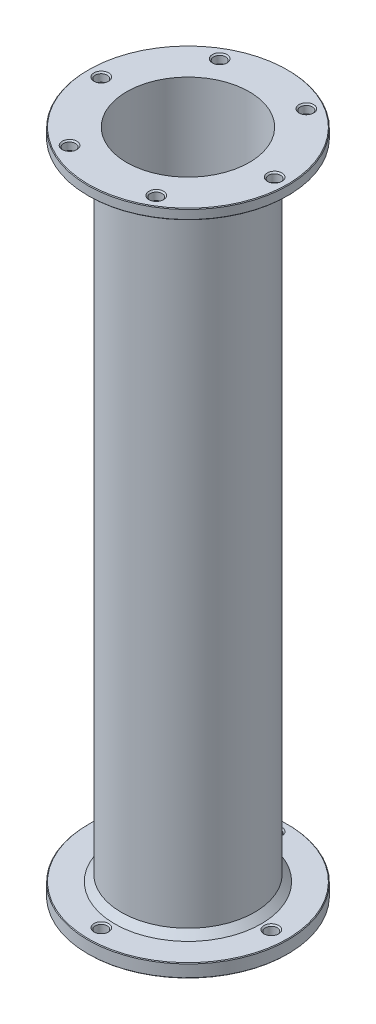
ISO-10303-21;
HEADER;
FILE_DESCRIPTION(('STEP AP214'),'2;1');
FILE_NAME('part.step','',(''),(''),'','','');
FILE_SCHEMA(('AUTOMOTIVE_DESIGN { 1 0 10303 214 1 1 1 1 }'));
ENDSEC;
DATA;
#1=APPLICATION_CONTEXT('core data for automotive mechanical design processes');
#2=APPLICATION_PROTOCOL_DEFINITION('international standard','automotive_design',2000,#1);
#3=PRODUCT_CONTEXT('',#1,'mechanical');
#4=PRODUCT('Part','Part','',(#3));
#5=PRODUCT_RELATED_PRODUCT_CATEGORY('part','',(#4));
#6=PRODUCT_DEFINITION_FORMATION('','',#4);
#7=PRODUCT_DEFINITION_CONTEXT('part definition',#1,'design');
#8=PRODUCT_DEFINITION('design','',#6,#7);
#9=PRODUCT_DEFINITION_SHAPE('','',#8);
#10=(LENGTH_UNIT() NAMED_UNIT(*) SI_UNIT(.MILLI.,.METRE.));
#11=(NAMED_UNIT(*) PLANE_ANGLE_UNIT() SI_UNIT($,.RADIAN.));
#12=(NAMED_UNIT(*) SI_UNIT($,.STERADIAN.) SOLID_ANGLE_UNIT());
#13=UNCERTAINTY_MEASURE_WITH_UNIT(LENGTH_MEASURE(1.E-05),#10,'distance_accuracy_value','');
#14=(GEOMETRIC_REPRESENTATION_CONTEXT(3) GLOBAL_UNCERTAINTY_ASSIGNED_CONTEXT((#13)) GLOBAL_UNIT_ASSIGNED_CONTEXT((#10,
#11,#12)) REPRESENTATION_CONTEXT('',''));
#15=CARTESIAN_POINT('',(0.,0.,0.));
#16=DIRECTION('',(0.,0.,1.));
#17=DIRECTION('',(1.,0.,0.));
#18=AXIS2_PLACEMENT_3D('',#15,#16,#17);
#19=CARTESIAN_POINT('',(0.,20.,0.));
#20=DIRECTION('',(0.,1.,0.));
#21=DIRECTION('',(0.,0.,1.));
#22=AXIS2_PLACEMENT_3D('',#19,#20,#21);
#23=PLANE('',#22);
#24=CARTESIAN_POINT('',(-5.00000000000045,20.,125.));
#25=DIRECTION('',(0.,1.,0.));
#26=DIRECTION('',(0.,0.,1.));
#27=AXIS2_PLACEMENT_3D('',#24,#25,#26);
#28=CIRCLE('',#27,11.0000000000001);
#29=CARTESIAN_POINT('',(-5.00000000000045,20.,136.000000000001));
#30=VERTEX_POINT('',#29);
#31=EDGE_CURVE('E142',#30,#30,#28,.F.);
#32=ORIENTED_EDGE('',*,*,#31,.T.);
#33=EDGE_LOOP('',(#32));
#34=FACE_BOUND('',#33,.T.);
#35=CARTESIAN_POINT('',(-130.,20.,-5.00000000000007));
#36=DIRECTION('',(0.,1.,0.));
#37=DIRECTION('',(0.,0.,1.));
#38=AXIS2_PLACEMENT_3D('',#35,#36,#37);
#39=CIRCLE('',#38,11.0000000000001);
#40=CARTESIAN_POINT('',(-130.,20.,6.00000000000005));
#41=VERTEX_POINT('',#40);
#42=EDGE_CURVE('E145',#41,#41,#39,.F.);
#43=ORIENTED_EDGE('',*,*,#42,.T.);
#44=EDGE_LOOP('',(#43));
#45=FACE_BOUND('',#44,.T.);
#46=CARTESIAN_POINT('',(0.,20.,-130.));
#47=DIRECTION('',(0.,1.,0.));
#48=DIRECTION('',(0.,0.,1.));
#49=AXIS2_PLACEMENT_3D('',#46,#47,#48);
#50=CIRCLE('',#49,11.0000000000001);
#51=CARTESIAN_POINT('',(0.,20.,-119.));
#52=VERTEX_POINT('',#51);
#53=EDGE_CURVE('E148',#52,#52,#50,.F.);
#54=ORIENTED_EDGE('',*,*,#53,.T.);
#55=EDGE_LOOP('',(#54));
#56=FACE_BOUND('',#55,.T.);
#57=CARTESIAN_POINT('',(125.,20.,4.36435167355392E-13));
#58=DIRECTION('',(0.,1.,0.));
#59=DIRECTION('',(0.,0.,1.));
#60=AXIS2_PLACEMENT_3D('',#57,#58,#59);
#61=CIRCLE('',#60,11.0000000000001);
#62=CARTESIAN_POINT('',(125.,20.,11.0000000000006));
#63=VERTEX_POINT('',#62);
#64=EDGE_CURVE('E151',#63,#63,#61,.F.);
#65=ORIENTED_EDGE('',*,*,#64,.T.);
#66=EDGE_LOOP('',(#65));
#67=FACE_BOUND('',#66,.T.);
#68=CARTESIAN_POINT('',(0.,20.,0.));
#69=DIRECTION('',(0.,1.,0.));
#70=DIRECTION('',(0.,0.,1.));
#71=AXIS2_PLACEMENT_3D('',#68,#69,#70);
#72=CIRCLE('',#71,149.);
#73=CARTESIAN_POINT('',(0.,20.,149.));
#74=VERTEX_POINT('',#73);
#75=EDGE_CURVE('E184',#74,#74,#72,.T.);
#76=ORIENTED_EDGE('',*,*,#75,.T.);
#77=EDGE_LOOP('',(#76));
#78=FACE_BOUND('',#77,.T.);
#79=CARTESIAN_POINT('',(0.,20.,0.));
#80=DIRECTION('',(0.,1.,0.));
#81=DIRECTION('',(0.,0.,1.));
#82=AXIS2_PLACEMENT_3D('',#79,#80,#81);
#83=CIRCLE('',#82,110.);
#84=CARTESIAN_POINT('',(0.,20.,110.));
#85=VERTEX_POINT('',#84);
#86=EDGE_CURVE('E196',#85,#85,#83,.F.);
#87=ORIENTED_EDGE('',*,*,#86,.T.);
#88=EDGE_LOOP('',(#87));
#89=FACE_BOUND('',#88,.T.);
#90=ADVANCED_FACE('F43',(#34,#45,#56,#67,#78,#89),#23,.T.);
#91=CARTESIAN_POINT('',(0.,0.,0.));
#92=DIRECTION('',(0.,1.,0.));
#93=DIRECTION('',(0.,0.,1.));
#94=AXIS2_PLACEMENT_3D('',#91,#92,#93);
#95=PLANE('',#94);
#96=CARTESIAN_POINT('',(-5.00000000000045,0.,125.));
#97=DIRECTION('',(0.,1.,0.));
#98=DIRECTION('',(0.,0.,1.));
#99=AXIS2_PLACEMENT_3D('',#96,#97,#98);
#100=CIRCLE('',#99,11.0000000000001);
#101=CARTESIAN_POINT('',(-5.00000000000045,0.,136.000000000001));
#102=VERTEX_POINT('',#101);
#103=EDGE_CURVE('E160',#102,#102,#100,.T.);
#104=ORIENTED_EDGE('',*,*,#103,.T.);
#105=EDGE_LOOP('',(#104));
#106=FACE_BOUND('',#105,.T.);
#107=CARTESIAN_POINT('',(-130.,0.,-5.00000000000007));
#108=DIRECTION('',(0.,1.,0.));
#109=DIRECTION('',(0.,0.,1.));
#110=AXIS2_PLACEMENT_3D('',#107,#108,#109);
#111=CIRCLE('',#110,10.9999999999999);
#112=CARTESIAN_POINT('',(-130.,0.,5.99999999999983));
#113=VERTEX_POINT('',#112);
#114=EDGE_CURVE('E163',#113,#113,#111,.T.);
#115=ORIENTED_EDGE('',*,*,#114,.T.);
#116=EDGE_LOOP('',(#115));
#117=FACE_BOUND('',#116,.T.);
#118=CARTESIAN_POINT('',(0.,0.,-130.));
#119=DIRECTION('',(0.,1.,0.));
#120=DIRECTION('',(0.,0.,1.));
#121=AXIS2_PLACEMENT_3D('',#118,#119,#120);
#122=CIRCLE('',#121,11.);
#123=CARTESIAN_POINT('',(0.,0.,-119.));
#124=VERTEX_POINT('',#123);
#125=EDGE_CURVE('E166',#124,#124,#122,.T.);
#126=ORIENTED_EDGE('',*,*,#125,.T.);
#127=EDGE_LOOP('',(#126));
#128=FACE_BOUND('',#127,.T.);
#129=CARTESIAN_POINT('',(125.,0.,4.36435167355392E-13));
#130=DIRECTION('',(0.,1.,0.));
#131=DIRECTION('',(0.,0.,1.));
#132=AXIS2_PLACEMENT_3D('',#129,#130,#131);
#133=CIRCLE('',#132,10.9999999999999);
#134=CARTESIAN_POINT('',(125.,0.,11.0000000000003));
#135=VERTEX_POINT('',#134);
#136=EDGE_CURVE('E169',#135,#135,#133,.T.);
#137=ORIENTED_EDGE('',*,*,#136,.T.);
#138=EDGE_LOOP('',(#137));
#139=FACE_BOUND('',#138,.T.);
#140=CARTESIAN_POINT('',(0.,0.,0.));
#141=DIRECTION('',(0.,1.,0.));
#142=DIRECTION('',(0.,0.,1.));
#143=AXIS2_PLACEMENT_3D('',#140,#141,#142);
#144=CIRCLE('',#143,149.);
#145=CARTESIAN_POINT('',(0.,0.,149.));
#146=VERTEX_POINT('',#145);
#147=EDGE_CURVE('E187',#146,#146,#144,.F.);
#148=ORIENTED_EDGE('',*,*,#147,.T.);
#149=EDGE_LOOP('',(#148));
#150=FACE_BOUND('',#149,.T.);
#151=CARTESIAN_POINT('',(0.,0.,0.));
#152=DIRECTION('',(0.,1.,0.));
#153=DIRECTION('',(0.,0.,1.));
#154=AXIS2_PLACEMENT_3D('',#151,#152,#153);
#155=CIRCLE('',#154,92.);
#156=CARTESIAN_POINT('',(0.,0.,92.));
#157=VERTEX_POINT('',#156);
#158=EDGE_CURVE('E208',#157,#157,#155,.T.);
#159=ORIENTED_EDGE('',*,*,#158,.T.);
#160=EDGE_LOOP('',(#159));
#161=FACE_BOUND('',#160,.T.);
#162=ADVANCED_FACE('F237',(#106,#117,#128,#139,#150,#161),#95,.F.);
#163=CARTESIAN_POINT('',(0.,20.,0.));
#164=DIRECTION('',(0.,-1.,0.));
#165=DIRECTION('',(0.,0.,-1.));
#166=AXIS2_PLACEMENT_3D('',#163,#164,#165);
#167=CYLINDRICAL_SURFACE('',#166,150.);
#168=CARTESIAN_POINT('',(0.,0.99999999999989,0.));
#169=DIRECTION('',(0.,1.,0.));
#170=DIRECTION('',(0.,0.,1.));
#171=AXIS2_PLACEMENT_3D('',#168,#169,#170);
#172=CIRCLE('',#171,150.);
#173=CARTESIAN_POINT('',(0.,0.99999999999989,150.));
#174=VERTEX_POINT('',#173);
#175=EDGE_CURVE('E190',#174,#174,#172,.T.);
#176=ORIENTED_EDGE('',*,*,#175,.T.);
#177=EDGE_LOOP('',(#176));
#178=FACE_BOUND('',#177,.T.);
#179=CARTESIAN_POINT('',(0.,18.9999999999998,0.));
#180=DIRECTION('',(0.,1.,0.));
#181=DIRECTION('',(0.,0.,1.));
#182=AXIS2_PLACEMENT_3D('',#179,#180,#181);
#183=CIRCLE('',#182,150.);
#184=CARTESIAN_POINT('',(0.,18.9999999999998,150.));
#185=VERTEX_POINT('',#184);
#186=EDGE_CURVE('E193',#185,#185,#183,.F.);
#187=ORIENTED_EDGE('',*,*,#186,.T.);
#188=EDGE_LOOP('',(#187));
#189=FACE_BOUND('',#188,.T.);
#190=ADVANCED_FACE('F244',(#178,#189),#167,.T.);
#191=CARTESIAN_POINT('',(0.,20.,0.));
#192=DIRECTION('',(0.,-1.,0.));
#193=DIRECTION('',(0.,0.,-1.));
#194=AXIS2_PLACEMENT_3D('',#191,#192,#193);
#195=CYLINDRICAL_SURFACE('',#194,92.);
#196=ORIENTED_EDGE('',*,*,#158,.F.);
#197=EDGE_LOOP('',(#196));
#198=FACE_BOUND('',#197,.T.);
#199=CARTESIAN_POINT('',(0.,1000.,0.));
#200=DIRECTION('',(0.,1.,0.));
#201=DIRECTION('',(0.,0.,1.));
#202=AXIS2_PLACEMENT_3D('',#199,#200,#201);
#203=CIRCLE('',#202,92.);
#204=CARTESIAN_POINT('',(0.,1000.,92.0000000000001));
#205=VERTEX_POINT('',#204);
#206=EDGE_CURVE('E211',#205,#205,#203,.T.);
#207=ORIENTED_EDGE('',*,*,#206,.T.);
#208=EDGE_LOOP('',(#207));
#209=FACE_BOUND('',#208,.T.);
#210=ADVANCED_FACE('F215',(#198,#209),#195,.F.);
#211=CARTESIAN_POINT('',(0.,20.,-130.));
#212=DIRECTION('',(0.,-1.,0.));
#213=DIRECTION('',(0.,0.,-1.));
#214=AXIS2_PLACEMENT_3D('',#211,#212,#213);
#215=CYLINDRICAL_SURFACE('',#214,9.00000000000001);
#216=CARTESIAN_POINT('',(0.,1.99999999999992,-130.));
#217=DIRECTION('',(0.,1.,0.));
#218=DIRECTION('',(0.,0.,1.));
#219=AXIS2_PLACEMENT_3D('',#216,#217,#218);
#220=CIRCLE('',#219,9.00000000000001);
#221=CARTESIAN_POINT('',(0.,1.99999999999992,-121.));
#222=VERTEX_POINT('',#221);
#223=EDGE_CURVE('E130',#222,#222,#220,.F.);
#224=ORIENTED_EDGE('',*,*,#223,.T.);
#225=EDGE_LOOP('',(#224));
#226=FACE_BOUND('',#225,.T.);
#227=CARTESIAN_POINT('',(0.,18.,-130.));
#228=DIRECTION('',(0.,1.,0.));
#229=DIRECTION('',(0.,0.,1.));
#230=AXIS2_PLACEMENT_3D('',#227,#228,#229);
#231=CIRCLE('',#230,9.00000000000001);
#232=CARTESIAN_POINT('',(0.,18.,-121.));
#233=VERTEX_POINT('',#232);
#234=EDGE_CURVE('E133',#233,#233,#231,.T.);
#235=ORIENTED_EDGE('',*,*,#234,.T.);
#236=EDGE_LOOP('',(#235));
#237=FACE_BOUND('',#236,.T.);
#238=ADVANCED_FACE('F464',(#226,#237),#215,.F.);
#239=CARTESIAN_POINT('',(125.,20.,4.36435167355392E-13));
#240=DIRECTION('',(0.,-1.,0.));
#241=DIRECTION('',(0.,0.,-1.));
#242=AXIS2_PLACEMENT_3D('',#239,#240,#241);
#243=CYLINDRICAL_SURFACE('',#242,9.00000000000001);
#244=CARTESIAN_POINT('',(125.,1.99999999999997,4.36435167355392E-13));
#245=DIRECTION('',(0.,1.,0.));
#246=DIRECTION('',(0.,0.,1.));
#247=AXIS2_PLACEMENT_3D('',#244,#245,#246);
#248=CIRCLE('',#247,9.00000000000001);
#249=CARTESIAN_POINT('',(125.,1.99999999999997,9.00000000000045));
#250=VERTEX_POINT('',#249);
#251=EDGE_CURVE('E124',#250,#250,#248,.F.);
#252=ORIENTED_EDGE('',*,*,#251,.T.);
#253=EDGE_LOOP('',(#252));
#254=FACE_BOUND('',#253,.T.);
#255=CARTESIAN_POINT('',(125.,18.,4.36435167355392E-13));
#256=DIRECTION('',(0.,1.,0.));
#257=DIRECTION('',(0.,0.,1.));
#258=AXIS2_PLACEMENT_3D('',#255,#256,#257);
#259=CIRCLE('',#258,9.00000000000001);
#260=CARTESIAN_POINT('',(125.,18.,9.00000000000045));
#261=VERTEX_POINT('',#260);
#262=EDGE_CURVE('E127',#261,#261,#259,.T.);
#263=ORIENTED_EDGE('',*,*,#262,.T.);
#264=EDGE_LOOP('',(#263));
#265=FACE_BOUND('',#264,.T.);
#266=ADVANCED_FACE('F461',(#254,#265),#243,.F.);
#267=CARTESIAN_POINT('',(-5.00000000000045,20.,125.));
#268=DIRECTION('',(0.,-1.,0.));
#269=DIRECTION('',(0.,0.,-1.));
#270=AXIS2_PLACEMENT_3D('',#267,#268,#269);
#271=CYLINDRICAL_SURFACE('',#270,8.99999999999999);
#272=CARTESIAN_POINT('',(-5.00000000000045,2.00000000000003,125.));
#273=DIRECTION('',(0.,1.,0.));
#274=DIRECTION('',(0.,0.,1.));
#275=AXIS2_PLACEMENT_3D('',#272,#273,#274);
#276=CIRCLE('',#275,8.99999999999999);
#277=CARTESIAN_POINT('',(-5.00000000000045,2.00000000000003,134.));
#278=VERTEX_POINT('',#277);
#279=EDGE_CURVE('E154',#278,#278,#276,.F.);
#280=ORIENTED_EDGE('',*,*,#279,.T.);
#281=EDGE_LOOP('',(#280));
#282=FACE_BOUND('',#281,.T.);
#283=CARTESIAN_POINT('',(-5.00000000000045,18.,125.));
#284=DIRECTION('',(0.,1.,0.));
#285=DIRECTION('',(0.,0.,1.));
#286=AXIS2_PLACEMENT_3D('',#283,#284,#285);
#287=CIRCLE('',#286,8.99999999999999);
#288=CARTESIAN_POINT('',(-5.00000000000045,18.,134.));
#289=VERTEX_POINT('',#288);
#290=EDGE_CURVE('E157',#289,#289,#287,.T.);
#291=ORIENTED_EDGE('',*,*,#290,.T.);
#292=EDGE_LOOP('',(#291));
#293=FACE_BOUND('',#292,.T.);
#294=ADVANCED_FACE('F457',(#282,#293),#271,.F.);
#295=CARTESIAN_POINT('',(-130.,20.,-5.00000000000007));
#296=DIRECTION('',(0.,-1.,0.));
#297=DIRECTION('',(0.,0.,-1.));
#298=AXIS2_PLACEMENT_3D('',#295,#296,#297);
#299=CYLINDRICAL_SURFACE('',#298,9.00000000000001);
#300=CARTESIAN_POINT('',(-130.,1.99999999999997,-5.00000000000007));
#301=DIRECTION('',(0.,1.,0.));
#302=DIRECTION('',(0.,0.,1.));
#303=AXIS2_PLACEMENT_3D('',#300,#301,#302);
#304=CIRCLE('',#303,9.00000000000001);
#305=CARTESIAN_POINT('',(-130.,1.99999999999997,3.99999999999994));
#306=VERTEX_POINT('',#305);
#307=EDGE_CURVE('E136',#306,#306,#304,.F.);
#308=ORIENTED_EDGE('',*,*,#307,.T.);
#309=EDGE_LOOP('',(#308));
#310=FACE_BOUND('',#309,.T.);
#311=CARTESIAN_POINT('',(-130.,18.,-5.00000000000007));
#312=DIRECTION('',(0.,1.,0.));
#313=DIRECTION('',(0.,0.,1.));
#314=AXIS2_PLACEMENT_3D('',#311,#312,#313);
#315=CIRCLE('',#314,9.00000000000001);
#316=CARTESIAN_POINT('',(-130.,18.,3.99999999999994));
#317=VERTEX_POINT('',#316);
#318=EDGE_CURVE('E139',#317,#317,#315,.T.);
#319=ORIENTED_EDGE('',*,*,#318,.T.);
#320=EDGE_LOOP('',(#319));
#321=FACE_BOUND('',#320,.T.);
#322=ADVANCED_FACE('F231',(#310,#321),#299,.F.);
#323=CARTESIAN_POINT('',(0.,985.,0.));
#324=DIRECTION('',(0.,-1.,0.));
#325=DIRECTION('',(0.,0.,-1.));
#326=AXIS2_PLACEMENT_3D('',#323,#324,#325);
#327=CYLINDRICAL_SURFACE('',#326,100.);
#328=CARTESIAN_POINT('',(0.,975.,0.));
#329=DIRECTION('',(0.,1.,0.));
#330=DIRECTION('',(0.,0.,1.));
#331=AXIS2_PLACEMENT_3D('',#328,#329,#330);
#332=CIRCLE('',#331,100.);
#333=CARTESIAN_POINT('',(0.,975.,100.));
#334=VERTEX_POINT('',#333);
#335=EDGE_CURVE('E199',#334,#334,#332,.F.);
#336=ORIENTED_EDGE('',*,*,#335,.T.);
#337=EDGE_LOOP('',(#336));
#338=FACE_BOUND('',#337,.T.);
#339=CARTESIAN_POINT('',(0.,29.9999999999999,0.));
#340=DIRECTION('',(0.,1.,0.));
#341=DIRECTION('',(0.,0.,1.));
#342=AXIS2_PLACEMENT_3D('',#339,#340,#341);
#343=CIRCLE('',#342,100.);
#344=CARTESIAN_POINT('',(0.,29.9999999999999,100.));
#345=VERTEX_POINT('',#344);
#346=EDGE_CURVE('E202',#345,#345,#343,.T.);
#347=ORIENTED_EDGE('',*,*,#346,.T.);
#348=EDGE_LOOP('',(#347));
#349=FACE_BOUND('',#348,.T.);
#350=ADVANCED_FACE('F220',(#338,#349),#327,.T.);
#351=CARTESIAN_POINT('',(0.,1000.,0.));
#352=DIRECTION('',(0.,1.,0.));
#353=DIRECTION('',(0.,0.,1.));
#354=AXIS2_PLACEMENT_3D('',#351,#352,#353);
#355=PLANE('',#354);
#356=CARTESIAN_POINT('',(-65.0000000000001,1000.,-112.583302491977));
#357=DIRECTION('',(0.,1.,0.));
#358=DIRECTION('',(0.,0.,1.));
#359=AXIS2_PLACEMENT_3D('',#356,#357,#358);
#360=CIRCLE('',#359,11.0000000000002);
#361=CARTESIAN_POINT('',(-65.0000000000001,1000.,-101.583302491977));
#362=VERTEX_POINT('',#361);
#363=EDGE_CURVE('E82',#362,#362,#360,.F.);
#364=ORIENTED_EDGE('',*,*,#363,.T.);
#365=EDGE_LOOP('',(#364));
#366=FACE_BOUND('',#365,.T.);
#367=CARTESIAN_POINT('',(-130.,1000.,0.));
#368=DIRECTION('',(0.,1.,0.));
#369=DIRECTION('',(0.,0.,1.));
#370=AXIS2_PLACEMENT_3D('',#367,#368,#369);
#371=CIRCLE('',#370,11.0000000000002);
#372=CARTESIAN_POINT('',(-130.,1000.,11.0000000000003));
#373=VERTEX_POINT('',#372);
#374=EDGE_CURVE('E85',#373,#373,#371,.F.);
#375=ORIENTED_EDGE('',*,*,#374,.T.);
#376=EDGE_LOOP('',(#375));
#377=FACE_BOUND('',#376,.T.);
#378=CARTESIAN_POINT('',(-65.,1000.,112.583302491977));
#379=DIRECTION('',(0.,1.,0.));
#380=DIRECTION('',(0.,0.,1.));
#381=AXIS2_PLACEMENT_3D('',#378,#379,#380);
#382=CIRCLE('',#381,11.0000000000002);
#383=CARTESIAN_POINT('',(-65.,1000.,123.583302491977));
#384=VERTEX_POINT('',#383);
#385=EDGE_CURVE('E88',#384,#384,#382,.F.);
#386=ORIENTED_EDGE('',*,*,#385,.T.);
#387=EDGE_LOOP('',(#386));
#388=FACE_BOUND('',#387,.T.);
#389=CARTESIAN_POINT('',(65.,1000.,112.583302491977));
#390=DIRECTION('',(0.,1.,0.));
#391=DIRECTION('',(0.,0.,1.));
#392=AXIS2_PLACEMENT_3D('',#389,#390,#391);
#393=CIRCLE('',#392,11.0000000000002);
#394=CARTESIAN_POINT('',(65.,1000.,123.583302491977));
#395=VERTEX_POINT('',#394);
#396=EDGE_CURVE('E91',#395,#395,#393,.F.);
#397=ORIENTED_EDGE('',*,*,#396,.T.);
#398=EDGE_LOOP('',(#397));
#399=FACE_BOUND('',#398,.T.);
#400=CARTESIAN_POINT('',(130.,1000.,0.));
#401=DIRECTION('',(0.,1.,0.));
#402=DIRECTION('',(0.,0.,1.));
#403=AXIS2_PLACEMENT_3D('',#400,#401,#402);
#404=CIRCLE('',#403,11.0000000000002);
#405=CARTESIAN_POINT('',(130.,1000.,11.0000000000003));
#406=VERTEX_POINT('',#405);
#407=EDGE_CURVE('E94',#406,#406,#404,.F.);
#408=ORIENTED_EDGE('',*,*,#407,.T.);
#409=EDGE_LOOP('',(#408));
#410=FACE_BOUND('',#409,.T.);
#411=CARTESIAN_POINT('',(65.,1000.,-112.583302491977));
#412=DIRECTION('',(0.,1.,0.));
#413=DIRECTION('',(0.,0.,1.));
#414=AXIS2_PLACEMENT_3D('',#411,#412,#413);
#415=CIRCLE('',#414,11.0000000000002);
#416=CARTESIAN_POINT('',(65.,1000.,-101.583302491977));
#417=VERTEX_POINT('',#416);
#418=EDGE_CURVE('E97',#417,#417,#415,.F.);
#419=ORIENTED_EDGE('',*,*,#418,.T.);
#420=EDGE_LOOP('',(#419));
#421=FACE_BOUND('',#420,.T.);
#422=CARTESIAN_POINT('',(0.,1000.,0.));
#423=DIRECTION('',(0.,1.,0.));
#424=DIRECTION('',(0.,0.,1.));
#425=AXIS2_PLACEMENT_3D('',#422,#423,#424);
#426=CIRCLE('',#425,149.);
#427=CARTESIAN_POINT('',(0.,1000.,149.));
#428=VERTEX_POINT('',#427);
#429=EDGE_CURVE('E172',#428,#428,#426,.T.);
#430=ORIENTED_EDGE('',*,*,#429,.T.);
#431=EDGE_LOOP('',(#430));
#432=FACE_BOUND('',#431,.T.);
#433=ORIENTED_EDGE('',*,*,#206,.F.);
#434=EDGE_LOOP('',(#433));
#435=FACE_BOUND('',#434,.T.);
#436=ADVANCED_FACE('F217',(#366,#377,#388,#399,#410,#421,#432,#435),#355,.T.);
#437=CARTESIAN_POINT('',(0.,985.,0.));
#438=DIRECTION('',(0.,1.,0.));
#439=DIRECTION('',(0.,0.,1.));
#440=AXIS2_PLACEMENT_3D('',#437,#438,#439);
#441=PLANE('',#440);
#442=CARTESIAN_POINT('',(-65.0000000000001,985.,-112.583302491977));
#443=DIRECTION('',(0.,1.,0.));
#444=DIRECTION('',(0.,0.,1.));
#445=AXIS2_PLACEMENT_3D('',#442,#443,#444);
#446=CIRCLE('',#445,11.0000000000003);
#447=CARTESIAN_POINT('',(-65.0000000000001,985.,-101.583302491977));
#448=VERTEX_POINT('',#447);
#449=EDGE_CURVE('E106',#448,#448,#446,.T.);
#450=ORIENTED_EDGE('',*,*,#449,.T.);
#451=EDGE_LOOP('',(#450));
#452=FACE_BOUND('',#451,.T.);
#453=CARTESIAN_POINT('',(-130.,985.,0.));
#454=DIRECTION('',(0.,1.,0.));
#455=DIRECTION('',(0.,0.,1.));
#456=AXIS2_PLACEMENT_3D('',#453,#454,#455);
#457=CIRCLE('',#456,11.0000000000002);
#458=CARTESIAN_POINT('',(-130.,985.,11.0000000000003));
#459=VERTEX_POINT('',#458);
#460=EDGE_CURVE('E109',#459,#459,#457,.T.);
#461=ORIENTED_EDGE('',*,*,#460,.T.);
#462=EDGE_LOOP('',(#461));
#463=FACE_BOUND('',#462,.T.);
#464=CARTESIAN_POINT('',(-65.,985.,112.583302491977));
#465=DIRECTION('',(0.,1.,0.));
#466=DIRECTION('',(0.,0.,1.));
#467=AXIS2_PLACEMENT_3D('',#464,#465,#466);
#468=CIRCLE('',#467,11.0000000000003);
#469=CARTESIAN_POINT('',(-65.,985.,123.583302491977));
#470=VERTEX_POINT('',#469);
#471=EDGE_CURVE('E112',#470,#470,#468,.T.);
#472=ORIENTED_EDGE('',*,*,#471,.T.);
#473=EDGE_LOOP('',(#472));
#474=FACE_BOUND('',#473,.T.);
#475=CARTESIAN_POINT('',(65.,985.,112.583302491977));
#476=DIRECTION('',(0.,1.,0.));
#477=DIRECTION('',(0.,0.,1.));
#478=AXIS2_PLACEMENT_3D('',#475,#476,#477);
#479=CIRCLE('',#478,11.0000000000003);
#480=CARTESIAN_POINT('',(65.,985.,123.583302491977));
#481=VERTEX_POINT('',#480);
#482=EDGE_CURVE('E115',#481,#481,#479,.T.);
#483=ORIENTED_EDGE('',*,*,#482,.T.);
#484=EDGE_LOOP('',(#483));
#485=FACE_BOUND('',#484,.T.);
#486=CARTESIAN_POINT('',(130.,985.,0.));
#487=DIRECTION('',(0.,1.,0.));
#488=DIRECTION('',(0.,0.,1.));
#489=AXIS2_PLACEMENT_3D('',#486,#487,#488);
#490=CIRCLE('',#489,11.0000000000002);
#491=CARTESIAN_POINT('',(130.,985.,11.0000000000003));
#492=VERTEX_POINT('',#491);
#493=EDGE_CURVE('E118',#492,#492,#490,.T.);
#494=ORIENTED_EDGE('',*,*,#493,.T.);
#495=EDGE_LOOP('',(#494));
#496=FACE_BOUND('',#495,.T.);
#497=CARTESIAN_POINT('',(65.,985.,-112.583302491977));
#498=DIRECTION('',(0.,1.,0.));
#499=DIRECTION('',(0.,0.,1.));
#500=AXIS2_PLACEMENT_3D('',#497,#498,#499);
#501=CIRCLE('',#500,11.0000000000003);
#502=CARTESIAN_POINT('',(65.,985.,-101.583302491977));
#503=VERTEX_POINT('',#502);
#504=EDGE_CURVE('E121',#503,#503,#501,.T.);
#505=ORIENTED_EDGE('',*,*,#504,.T.);
#506=EDGE_LOOP('',(#505));
#507=FACE_BOUND('',#506,.T.);
#508=CARTESIAN_POINT('',(0.,985.,0.));
#509=DIRECTION('',(0.,1.,0.));
#510=DIRECTION('',(0.,0.,1.));
#511=AXIS2_PLACEMENT_3D('',#508,#509,#510);
#512=CIRCLE('',#511,149.);
#513=CARTESIAN_POINT('',(0.,985.,149.));
#514=VERTEX_POINT('',#513);
#515=EDGE_CURVE('E175',#514,#514,#512,.F.);
#516=ORIENTED_EDGE('',*,*,#515,.T.);
#517=EDGE_LOOP('',(#516));
#518=FACE_BOUND('',#517,.T.);
#519=CARTESIAN_POINT('',(0.,985.,0.));
#520=DIRECTION('',(0.,1.,0.));
#521=DIRECTION('',(0.,0.,1.));
#522=AXIS2_PLACEMENT_3D('',#519,#520,#521);
#523=CIRCLE('',#522,110.);
#524=CARTESIAN_POINT('',(0.,985.,110.));
#525=VERTEX_POINT('',#524);
#526=EDGE_CURVE('E205',#525,#525,#523,.T.);
#527=ORIENTED_EDGE('',*,*,#526,.T.);
#528=EDGE_LOOP('',(#527));
#529=FACE_BOUND('',#528,.T.);
#530=ADVANCED_FACE('F219',(#452,#463,#474,#485,#496,#507,#518,#529),#441,.F.);
#531=CARTESIAN_POINT('',(0.,1000.,0.));
#532=DIRECTION('',(0.,-1.,0.));
#533=DIRECTION('',(0.,0.,-1.));
#534=AXIS2_PLACEMENT_3D('',#531,#532,#533);
#535=CYLINDRICAL_SURFACE('',#534,150.);
#536=CARTESIAN_POINT('',(0.,986.,0.));
#537=DIRECTION('',(0.,1.,0.));
#538=DIRECTION('',(0.,0.,1.));
#539=AXIS2_PLACEMENT_3D('',#536,#537,#538);
#540=CIRCLE('',#539,150.);
#541=CARTESIAN_POINT('',(0.,986.,150.));
#542=VERTEX_POINT('',#541);
#543=EDGE_CURVE('E178',#542,#542,#540,.T.);
#544=ORIENTED_EDGE('',*,*,#543,.T.);
#545=EDGE_LOOP('',(#544));
#546=FACE_BOUND('',#545,.T.);
#547=CARTESIAN_POINT('',(0.,998.999999999999,0.));
#548=DIRECTION('',(0.,1.,0.));
#549=DIRECTION('',(0.,0.,1.));
#550=AXIS2_PLACEMENT_3D('',#547,#548,#549);
#551=CIRCLE('',#550,150.);
#552=CARTESIAN_POINT('',(0.,998.999999999999,150.));
#553=VERTEX_POINT('',#552);
#554=EDGE_CURVE('E181',#553,#553,#551,.F.);
#555=ORIENTED_EDGE('',*,*,#554,.T.);
#556=EDGE_LOOP('',(#555));
#557=FACE_BOUND('',#556,.T.);
#558=ADVANCED_FACE('F227',(#546,#557),#535,.T.);
#559=CARTESIAN_POINT('',(130.,1000.,0.));
#560=DIRECTION('',(0.,-1.,0.));
#561=DIRECTION('',(0.,0.,-1.));
#562=AXIS2_PLACEMENT_3D('',#559,#560,#561);
#563=CYLINDRICAL_SURFACE('',#562,9.00000000000001);
#564=CARTESIAN_POINT('',(130.,987.,0.));
#565=DIRECTION('',(0.,1.,0.));
#566=DIRECTION('',(0.,0.,1.));
#567=AXIS2_PLACEMENT_3D('',#564,#565,#566);
#568=CIRCLE('',#567,9.00000000000001);
#569=CARTESIAN_POINT('',(130.,987.,9.00000000000007));
#570=VERTEX_POINT('',#569);
#571=EDGE_CURVE('E55',#570,#570,#568,.F.);
#572=ORIENTED_EDGE('',*,*,#571,.T.);
#573=EDGE_LOOP('',(#572));
#574=FACE_BOUND('',#573,.T.);
#575=CARTESIAN_POINT('',(130.,998.,0.));
#576=DIRECTION('',(0.,1.,0.));
#577=DIRECTION('',(0.,0.,1.));
#578=AXIS2_PLACEMENT_3D('',#575,#576,#577);
#579=CIRCLE('',#578,9.00000000000001);
#580=CARTESIAN_POINT('',(130.,998.,9.00000000000007));
#581=VERTEX_POINT('',#580);
#582=EDGE_CURVE('E59',#581,#581,#579,.T.);
#583=ORIENTED_EDGE('',*,*,#582,.T.);
#584=EDGE_LOOP('',(#583));
#585=FACE_BOUND('',#584,.T.);
#586=ADVANCED_FACE('F444',(#574,#585),#563,.F.);
#587=CARTESIAN_POINT('',(65.,1000.,112.583302491977));
#588=DIRECTION('',(0.,-1.,0.));
#589=DIRECTION('',(0.,0.,-1.));
#590=AXIS2_PLACEMENT_3D('',#587,#588,#589);
#591=CYLINDRICAL_SURFACE('',#590,9.00000000000002);
#592=CARTESIAN_POINT('',(65.,987.,112.583302491977));
#593=DIRECTION('',(0.,1.,0.));
#594=DIRECTION('',(0.,0.,1.));
#595=AXIS2_PLACEMENT_3D('',#592,#593,#594);
#596=CIRCLE('',#595,9.00000000000002);
#597=CARTESIAN_POINT('',(65.,987.,121.583302491977));
#598=VERTEX_POINT('',#597);
#599=EDGE_CURVE('E64',#598,#598,#596,.F.);
#600=ORIENTED_EDGE('',*,*,#599,.T.);
#601=EDGE_LOOP('',(#600));
#602=FACE_BOUND('',#601,.T.);
#603=CARTESIAN_POINT('',(65.,998.,112.583302491977));
#604=DIRECTION('',(0.,1.,0.));
#605=DIRECTION('',(0.,0.,1.));
#606=AXIS2_PLACEMENT_3D('',#603,#604,#605);
#607=CIRCLE('',#606,9.00000000000002);
#608=CARTESIAN_POINT('',(65.,998.,121.583302491977));
#609=VERTEX_POINT('',#608);
#610=EDGE_CURVE('E67',#609,#609,#607,.T.);
#611=ORIENTED_EDGE('',*,*,#610,.T.);
#612=EDGE_LOOP('',(#611));
#613=FACE_BOUND('',#612,.T.);
#614=ADVANCED_FACE('F453',(#602,#613),#591,.F.);
#615=CARTESIAN_POINT('',(-65.,1000.,112.583302491977));
#616=DIRECTION('',(0.,-1.,0.));
#617=DIRECTION('',(0.,0.,-1.));
#618=AXIS2_PLACEMENT_3D('',#615,#616,#617);
#619=CYLINDRICAL_SURFACE('',#618,9.00000000000001);
#620=CARTESIAN_POINT('',(-65.,987.,112.583302491977));
#621=DIRECTION('',(0.,1.,0.));
#622=DIRECTION('',(0.,0.,1.));
#623=AXIS2_PLACEMENT_3D('',#620,#621,#622);
#624=CIRCLE('',#623,9.00000000000001);
#625=CARTESIAN_POINT('',(-65.,987.,121.583302491977));
#626=VERTEX_POINT('',#625);
#627=EDGE_CURVE('E70',#626,#626,#624,.F.);
#628=ORIENTED_EDGE('',*,*,#627,.T.);
#629=EDGE_LOOP('',(#628));
#630=FACE_BOUND('',#629,.T.);
#631=CARTESIAN_POINT('',(-65.,998.,112.583302491977));
#632=DIRECTION('',(0.,1.,0.));
#633=DIRECTION('',(0.,0.,1.));
#634=AXIS2_PLACEMENT_3D('',#631,#632,#633);
#635=CIRCLE('',#634,9.00000000000001);
#636=CARTESIAN_POINT('',(-65.,998.,121.583302491977));
#637=VERTEX_POINT('',#636);
#638=EDGE_CURVE('E73',#637,#637,#635,.T.);
#639=ORIENTED_EDGE('',*,*,#638,.T.);
#640=EDGE_LOOP('',(#639));
#641=FACE_BOUND('',#640,.T.);
#642=ADVANCED_FACE('F587',(#630,#641),#619,.F.);
#643=CARTESIAN_POINT('',(-130.,1000.,0.));
#644=DIRECTION('',(0.,-1.,0.));
#645=DIRECTION('',(0.,0.,-1.));
#646=AXIS2_PLACEMENT_3D('',#643,#644,#645);
#647=CYLINDRICAL_SURFACE('',#646,9.00000000000002);
#648=CARTESIAN_POINT('',(-130.,987.,0.));
#649=DIRECTION('',(0.,1.,0.));
#650=DIRECTION('',(0.,0.,1.));
#651=AXIS2_PLACEMENT_3D('',#648,#649,#650);
#652=CIRCLE('',#651,9.00000000000002);
#653=CARTESIAN_POINT('',(-130.,987.,9.0000000000001));
#654=VERTEX_POINT('',#653);
#655=EDGE_CURVE('E76',#654,#654,#652,.F.);
#656=ORIENTED_EDGE('',*,*,#655,.T.);
#657=EDGE_LOOP('',(#656));
#658=FACE_BOUND('',#657,.T.);
#659=CARTESIAN_POINT('',(-130.,998.,0.));
#660=DIRECTION('',(0.,1.,0.));
#661=DIRECTION('',(0.,0.,1.));
#662=AXIS2_PLACEMENT_3D('',#659,#660,#661);
#663=CIRCLE('',#662,9.00000000000002);
#664=CARTESIAN_POINT('',(-130.,998.,9.0000000000001));
#665=VERTEX_POINT('',#664);
#666=EDGE_CURVE('E79',#665,#665,#663,.T.);
#667=ORIENTED_EDGE('',*,*,#666,.T.);
#668=EDGE_LOOP('',(#667));
#669=FACE_BOUND('',#668,.T.);
#670=ADVANCED_FACE('F596',(#658,#669),#647,.F.);
#671=CARTESIAN_POINT('',(-65.0000000000001,1000.,-112.583302491977));
#672=DIRECTION('',(0.,-1.,0.));
#673=DIRECTION('',(0.,0.,-1.));
#674=AXIS2_PLACEMENT_3D('',#671,#672,#673);
#675=CYLINDRICAL_SURFACE('',#674,9.00000000000002);
#676=CARTESIAN_POINT('',(-65.0000000000001,987.,-112.583302491977));
#677=DIRECTION('',(0.,1.,0.));
#678=DIRECTION('',(0.,0.,1.));
#679=AXIS2_PLACEMENT_3D('',#676,#677,#678);
#680=CIRCLE('',#679,9.00000000000002);
#681=CARTESIAN_POINT('',(-65.0000000000001,987.,-103.583302491977));
#682=VERTEX_POINT('',#681);
#683=EDGE_CURVE('E100',#682,#682,#680,.F.);
#684=ORIENTED_EDGE('',*,*,#683,.T.);
#685=EDGE_LOOP('',(#684));
#686=FACE_BOUND('',#685,.T.);
#687=CARTESIAN_POINT('',(-65.0000000000001,998.,-112.583302491977));
#688=DIRECTION('',(0.,1.,0.));
#689=DIRECTION('',(0.,0.,1.));
#690=AXIS2_PLACEMENT_3D('',#687,#688,#689);
#691=CIRCLE('',#690,9.00000000000002);
#692=CARTESIAN_POINT('',(-65.0000000000001,998.,-103.583302491977));
#693=VERTEX_POINT('',#692);
#694=EDGE_CURVE('E103',#693,#693,#691,.T.);
#695=ORIENTED_EDGE('',*,*,#694,.T.);
#696=EDGE_LOOP('',(#695));
#697=FACE_BOUND('',#696,.T.);
#698=ADVANCED_FACE('F605',(#686,#697),#675,.F.);
#699=CARTESIAN_POINT('',(65.,1000.,-112.583302491977));
#700=DIRECTION('',(0.,-1.,0.));
#701=DIRECTION('',(0.,0.,-1.));
#702=AXIS2_PLACEMENT_3D('',#699,#700,#701);
#703=CYLINDRICAL_SURFACE('',#702,9.00000000000002);
#704=CARTESIAN_POINT('',(65.,987.,-112.583302491977));
#705=DIRECTION('',(0.,1.,0.));
#706=DIRECTION('',(0.,0.,1.));
#707=AXIS2_PLACEMENT_3D('',#704,#705,#706);
#708=CIRCLE('',#707,9.00000000000002);
#709=CARTESIAN_POINT('',(65.,987.,-103.583302491977));
#710=VERTEX_POINT('',#709);
#711=EDGE_CURVE('E10',#710,#710,#708,.F.);
#712=ORIENTED_EDGE('',*,*,#711,.T.);
#713=EDGE_LOOP('',(#712));
#714=FACE_BOUND('',#713,.T.);
#715=CARTESIAN_POINT('',(65.,998.,-112.583302491977));
#716=DIRECTION('',(0.,1.,0.));
#717=DIRECTION('',(0.,0.,1.));
#718=AXIS2_PLACEMENT_3D('',#715,#716,#717);
#719=CIRCLE('',#718,9.00000000000002);
#720=CARTESIAN_POINT('',(65.,998.,-103.583302491977));
#721=VERTEX_POINT('',#720);
#722=EDGE_CURVE('E51',#721,#721,#719,.T.);
#723=ORIENTED_EDGE('',*,*,#722,.T.);
#724=EDGE_LOOP('',(#723));
#725=FACE_BOUND('',#724,.T.);
#726=ADVANCED_FACE('F262',(#714,#725),#703,.F.);
#727=CARTESIAN_POINT('',(0.,985.,0.));
#728=DIRECTION('',(0.,1.,0.));
#729=DIRECTION('',(0.,0.,1.));
#730=AXIS2_PLACEMENT_3D('',#727,#728,#729);
#731=CONICAL_SURFACE('',#730,110.,0.785398163397452);
#732=ORIENTED_EDGE('',*,*,#335,.F.);
#733=EDGE_LOOP('',(#732));
#734=FACE_BOUND('',#733,.T.);
#735=ORIENTED_EDGE('',*,*,#526,.F.);
#736=EDGE_LOOP('',(#735));
#737=FACE_BOUND('',#736,.T.);
#738=ADVANCED_FACE('F255',(#734,#737),#731,.T.);
#739=CARTESIAN_POINT('',(0.,29.9999999999999,0.));
#740=DIRECTION('',(0.,-1.,0.));
#741=DIRECTION('',(0.,0.,-1.));
#742=AXIS2_PLACEMENT_3D('',#739,#740,#741);
#743=CONICAL_SURFACE('',#742,100.,0.785398163397448);
#744=ORIENTED_EDGE('',*,*,#86,.F.);
#745=EDGE_LOOP('',(#744));
#746=FACE_BOUND('',#745,.T.);
#747=ORIENTED_EDGE('',*,*,#346,.F.);
#748=EDGE_LOOP('',(#747));
#749=FACE_BOUND('',#748,.T.);
#750=ADVANCED_FACE('F261',(#746,#749),#743,.T.);
#751=CARTESIAN_POINT('',(0.,0.99999999999989,0.));
#752=DIRECTION('',(0.,1.,0.));
#753=DIRECTION('',(0.,0.,1.));
#754=AXIS2_PLACEMENT_3D('',#751,#752,#753);
#755=CONICAL_SURFACE('',#754,150.,0.785398163397421);
#756=ORIENTED_EDGE('',*,*,#147,.F.);
#757=EDGE_LOOP('',(#756));
#758=FACE_BOUND('',#757,.T.);
#759=ORIENTED_EDGE('',*,*,#175,.F.);
#760=EDGE_LOOP('',(#759));
#761=FACE_BOUND('',#760,.T.);
#762=ADVANCED_FACE('F269',(#758,#761),#755,.T.);
#763=CARTESIAN_POINT('',(0.,20.,0.));
#764=DIRECTION('',(0.,-1.,0.));
#765=DIRECTION('',(0.,0.,-1.));
#766=AXIS2_PLACEMENT_3D('',#763,#764,#765);
#767=CONICAL_SURFACE('',#766,149.,0.785398163397421);
#768=ORIENTED_EDGE('',*,*,#186,.F.);
#769=EDGE_LOOP('',(#768));
#770=FACE_BOUND('',#769,.T.);
#771=ORIENTED_EDGE('',*,*,#75,.F.);
#772=EDGE_LOOP('',(#771));
#773=FACE_BOUND('',#772,.T.);
#774=ADVANCED_FACE('F276',(#770,#773),#767,.T.);
#775=CARTESIAN_POINT('',(0.,986.,0.));
#776=DIRECTION('',(0.,1.,0.));
#777=DIRECTION('',(0.,0.,1.));
#778=AXIS2_PLACEMENT_3D('',#775,#776,#777);
#779=CONICAL_SURFACE('',#778,150.,0.785398163397448);
#780=ORIENTED_EDGE('',*,*,#515,.F.);
#781=EDGE_LOOP('',(#780));
#782=FACE_BOUND('',#781,.T.);
#783=ORIENTED_EDGE('',*,*,#543,.F.);
#784=EDGE_LOOP('',(#783));
#785=FACE_BOUND('',#784,.T.);
#786=ADVANCED_FACE('F283',(#782,#785),#779,.T.);
#787=CARTESIAN_POINT('',(0.,1000.,0.));
#788=DIRECTION('',(0.,-1.,0.));
#789=DIRECTION('',(0.,0.,-1.));
#790=AXIS2_PLACEMENT_3D('',#787,#788,#789);
#791=CONICAL_SURFACE('',#790,149.,0.785398163397393);
#792=ORIENTED_EDGE('',*,*,#554,.F.);
#793=EDGE_LOOP('',(#792));
#794=FACE_BOUND('',#793,.T.);
#795=ORIENTED_EDGE('',*,*,#429,.F.);
#796=EDGE_LOOP('',(#795));
#797=FACE_BOUND('',#796,.T.);
#798=ADVANCED_FACE('F290',(#794,#797),#791,.T.);
#799=CARTESIAN_POINT('',(-5.00000000000045,0.,125.));
#800=DIRECTION('',(0.,-1.,0.));
#801=DIRECTION('',(0.,0.,-1.));
#802=AXIS2_PLACEMENT_3D('',#799,#800,#801);
#803=CONICAL_SURFACE('',#802,11.0000000000001,0.785398163397472);
#804=ORIENTED_EDGE('',*,*,#279,.F.);
#805=EDGE_LOOP('',(#804));
#806=FACE_BOUND('',#805,.T.);
#807=ORIENTED_EDGE('',*,*,#103,.F.);
#808=EDGE_LOOP('',(#807));
#809=FACE_BOUND('',#808,.T.);
#810=ADVANCED_FACE('F296',(#806,#809),#803,.F.);
#811=CARTESIAN_POINT('',(-5.00000000000045,18.,125.));
#812=DIRECTION('',(0.,1.,0.));
#813=DIRECTION('',(0.,0.,1.));
#814=AXIS2_PLACEMENT_3D('',#811,#812,#813);
#815=CONICAL_SURFACE('',#814,8.99999999999999,0.785398163397468);
#816=ORIENTED_EDGE('',*,*,#31,.F.);
#817=EDGE_LOOP('',(#816));
#818=FACE_BOUND('',#817,.T.);
#819=ORIENTED_EDGE('',*,*,#290,.F.);
#820=EDGE_LOOP('',(#819));
#821=FACE_BOUND('',#820,.T.);
#822=ADVANCED_FACE('F303',(#818,#821),#815,.F.);
#823=CARTESIAN_POINT('',(-130.,0.,-5.00000000000007));
#824=DIRECTION('',(0.,-1.,0.));
#825=DIRECTION('',(0.,0.,-1.));
#826=AXIS2_PLACEMENT_3D('',#823,#824,#825);
#827=CONICAL_SURFACE('',#826,10.9999999999999,0.785398163397428);
#828=ORIENTED_EDGE('',*,*,#307,.F.);
#829=EDGE_LOOP('',(#828));
#830=FACE_BOUND('',#829,.T.);
#831=ORIENTED_EDGE('',*,*,#114,.F.);
#832=EDGE_LOOP('',(#831));
#833=FACE_BOUND('',#832,.T.);
#834=ADVANCED_FACE('F310',(#830,#833),#827,.F.);
#835=CARTESIAN_POINT('',(-130.,18.,-5.00000000000007));
#836=DIRECTION('',(0.,1.,0.));
#837=DIRECTION('',(0.,0.,1.));
#838=AXIS2_PLACEMENT_3D('',#835,#836,#837);
#839=CONICAL_SURFACE('',#838,9.00000000000001,0.785398163397469);
#840=ORIENTED_EDGE('',*,*,#42,.F.);
#841=EDGE_LOOP('',(#840));
#842=FACE_BOUND('',#841,.T.);
#843=ORIENTED_EDGE('',*,*,#318,.F.);
#844=EDGE_LOOP('',(#843));
#845=FACE_BOUND('',#844,.T.);
#846=ADVANCED_FACE('F317',(#842,#845),#839,.F.);
#847=CARTESIAN_POINT('',(0.,0.,-130.));
#848=DIRECTION('',(0.,-1.,0.));
#849=DIRECTION('',(0.,0.,-1.));
#850=AXIS2_PLACEMENT_3D('',#847,#848,#849);
#851=CONICAL_SURFACE('',#850,11.,0.785398163397469);
#852=ORIENTED_EDGE('',*,*,#223,.F.);
#853=EDGE_LOOP('',(#852));
#854=FACE_BOUND('',#853,.T.);
#855=ORIENTED_EDGE('',*,*,#125,.F.);
#856=EDGE_LOOP('',(#855));
#857=FACE_BOUND('',#856,.T.);
#858=ADVANCED_FACE('F324',(#854,#857),#851,.F.);
#859=CARTESIAN_POINT('',(0.,18.,-130.));
#860=DIRECTION('',(0.,1.,0.));
#861=DIRECTION('',(0.,0.,1.));
#862=AXIS2_PLACEMENT_3D('',#859,#860,#861);
#863=CONICAL_SURFACE('',#862,9.00000000000001,0.785398163397468);
#864=ORIENTED_EDGE('',*,*,#53,.F.);
#865=EDGE_LOOP('',(#864));
#866=FACE_BOUND('',#865,.T.);
#867=ORIENTED_EDGE('',*,*,#234,.F.);
#868=EDGE_LOOP('',(#867));
#869=FACE_BOUND('',#868,.T.);
#870=ADVANCED_FACE('F331',(#866,#869),#863,.F.);
#871=CARTESIAN_POINT('',(125.,0.,4.36435167355392E-13));
#872=DIRECTION('',(0.,-1.,0.));
#873=DIRECTION('',(0.,0.,-1.));
#874=AXIS2_PLACEMENT_3D('',#871,#872,#873);
#875=CONICAL_SURFACE('',#874,10.9999999999999,0.785398163397428);
#876=ORIENTED_EDGE('',*,*,#251,.F.);
#877=EDGE_LOOP('',(#876));
#878=FACE_BOUND('',#877,.T.);
#879=ORIENTED_EDGE('',*,*,#136,.F.);
#880=EDGE_LOOP('',(#879));
#881=FACE_BOUND('',#880,.T.);
#882=ADVANCED_FACE('F338',(#878,#881),#875,.F.);
#883=CARTESIAN_POINT('',(125.,18.,4.36435167355392E-13));
#884=DIRECTION('',(0.,1.,0.));
#885=DIRECTION('',(0.,0.,1.));
#886=AXIS2_PLACEMENT_3D('',#883,#884,#885);
#887=CONICAL_SURFACE('',#886,9.00000000000001,0.785398163397469);
#888=ORIENTED_EDGE('',*,*,#64,.F.);
#889=EDGE_LOOP('',(#888));
#890=FACE_BOUND('',#889,.T.);
#891=ORIENTED_EDGE('',*,*,#262,.F.);
#892=EDGE_LOOP('',(#891));
#893=FACE_BOUND('',#892,.T.);
#894=ADVANCED_FACE('F345',(#890,#893),#887,.F.);
#895=CARTESIAN_POINT('',(-65.0000000000001,985.,-112.583302491977));
#896=DIRECTION('',(0.,-1.,0.));
#897=DIRECTION('',(0.,0.,-1.));
#898=AXIS2_PLACEMENT_3D('',#895,#896,#897);
#899=CONICAL_SURFACE('',#898,11.0000000000003,0.785398163397444);
#900=ORIENTED_EDGE('',*,*,#683,.F.);
#901=EDGE_LOOP('',(#900));
#902=FACE_BOUND('',#901,.T.);
#903=ORIENTED_EDGE('',*,*,#449,.F.);
#904=EDGE_LOOP('',(#903));
#905=FACE_BOUND('',#904,.T.);
#906=ADVANCED_FACE('F352',(#902,#905),#899,.F.);
#907=CARTESIAN_POINT('',(-65.0000000000001,998.,-112.583302491977));
#908=DIRECTION('',(0.,1.,0.));
#909=DIRECTION('',(0.,0.,1.));
#910=AXIS2_PLACEMENT_3D('',#907,#908,#909);
#911=CONICAL_SURFACE('',#910,9.00000000000002,0.785398163397444);
#912=ORIENTED_EDGE('',*,*,#363,.F.);
#913=EDGE_LOOP('',(#912));
#914=FACE_BOUND('',#913,.T.);
#915=ORIENTED_EDGE('',*,*,#694,.F.);
#916=EDGE_LOOP('',(#915));
#917=FACE_BOUND('',#916,.T.);
#918=ADVANCED_FACE('F359',(#914,#917),#911,.F.);
#919=CARTESIAN_POINT('',(-130.,985.,0.));
#920=DIRECTION('',(0.,-1.,0.));
#921=DIRECTION('',(0.,0.,-1.));
#922=AXIS2_PLACEMENT_3D('',#919,#920,#921);
#923=CONICAL_SURFACE('',#922,11.0000000000002,0.785398163397416);
#924=ORIENTED_EDGE('',*,*,#655,.F.);
#925=EDGE_LOOP('',(#924));
#926=FACE_BOUND('',#925,.T.);
#927=ORIENTED_EDGE('',*,*,#460,.F.);
#928=EDGE_LOOP('',(#927));
#929=FACE_BOUND('',#928,.T.);
#930=ADVANCED_FACE('F366',(#926,#929),#923,.F.);
#931=CARTESIAN_POINT('',(-130.,998.,0.));
#932=DIRECTION('',(0.,1.,0.));
#933=DIRECTION('',(0.,0.,1.));
#934=AXIS2_PLACEMENT_3D('',#931,#932,#933);
#935=CONICAL_SURFACE('',#934,9.00000000000002,0.785398163397444);
#936=ORIENTED_EDGE('',*,*,#374,.F.);
#937=EDGE_LOOP('',(#936));
#938=FACE_BOUND('',#937,.T.);
#939=ORIENTED_EDGE('',*,*,#666,.F.);
#940=EDGE_LOOP('',(#939));
#941=FACE_BOUND('',#940,.T.);
#942=ADVANCED_FACE('F373',(#938,#941),#935,.F.);
#943=CARTESIAN_POINT('',(-65.,985.,112.583302491977));
#944=DIRECTION('',(0.,-1.,0.));
#945=DIRECTION('',(0.,0.,-1.));
#946=AXIS2_PLACEMENT_3D('',#943,#944,#945);
#947=CONICAL_SURFACE('',#946,11.0000000000003,0.785398163397447);
#948=ORIENTED_EDGE('',*,*,#627,.F.);
#949=EDGE_LOOP('',(#948));
#950=FACE_BOUND('',#949,.T.);
#951=ORIENTED_EDGE('',*,*,#471,.F.);
#952=EDGE_LOOP('',(#951));
#953=FACE_BOUND('',#952,.T.);
#954=ADVANCED_FACE('F380',(#950,#953),#947,.F.);
#955=CARTESIAN_POINT('',(-65.,998.,112.583302491977));
#956=DIRECTION('',(0.,1.,0.));
#957=DIRECTION('',(0.,0.,1.));
#958=AXIS2_PLACEMENT_3D('',#955,#956,#957);
#959=CONICAL_SURFACE('',#958,9.00000000000001,0.785398163397447);
#960=ORIENTED_EDGE('',*,*,#385,.F.);
#961=EDGE_LOOP('',(#960));
#962=FACE_BOUND('',#961,.T.);
#963=ORIENTED_EDGE('',*,*,#638,.F.);
#964=EDGE_LOOP('',(#963));
#965=FACE_BOUND('',#964,.T.);
#966=ADVANCED_FACE('F387',(#962,#965),#959,.F.);
#967=CARTESIAN_POINT('',(65.,985.,112.583302491977));
#968=DIRECTION('',(0.,-1.,0.));
#969=DIRECTION('',(0.,0.,-1.));
#970=AXIS2_PLACEMENT_3D('',#967,#968,#969);
#971=CONICAL_SURFACE('',#970,11.0000000000003,0.785398163397444);
#972=ORIENTED_EDGE('',*,*,#599,.F.);
#973=EDGE_LOOP('',(#972));
#974=FACE_BOUND('',#973,.T.);
#975=ORIENTED_EDGE('',*,*,#482,.F.);
#976=EDGE_LOOP('',(#975));
#977=FACE_BOUND('',#976,.T.);
#978=ADVANCED_FACE('F394',(#974,#977),#971,.F.);
#979=CARTESIAN_POINT('',(65.,998.,112.583302491977));
#980=DIRECTION('',(0.,1.,0.));
#981=DIRECTION('',(0.,0.,1.));
#982=AXIS2_PLACEMENT_3D('',#979,#980,#981);
#983=CONICAL_SURFACE('',#982,9.00000000000002,0.785398163397444);
#984=ORIENTED_EDGE('',*,*,#396,.F.);
#985=EDGE_LOOP('',(#984));
#986=FACE_BOUND('',#985,.T.);
#987=ORIENTED_EDGE('',*,*,#610,.F.);
#988=EDGE_LOOP('',(#987));
#989=FACE_BOUND('',#988,.T.);
#990=ADVANCED_FACE('F401',(#986,#989),#983,.F.);
#991=CARTESIAN_POINT('',(130.,985.,0.));
#992=DIRECTION('',(0.,-1.,0.));
#993=DIRECTION('',(0.,0.,-1.));
#994=AXIS2_PLACEMENT_3D('',#991,#992,#993);
#995=CONICAL_SURFACE('',#994,11.0000000000002,0.78539816339742);
#996=ORIENTED_EDGE('',*,*,#571,.F.);
#997=EDGE_LOOP('',(#996));
#998=FACE_BOUND('',#997,.T.);
#999=ORIENTED_EDGE('',*,*,#493,.F.);
#1000=EDGE_LOOP('',(#999));
#1001=FACE_BOUND('',#1000,.T.);
#1002=ADVANCED_FACE('F408',(#998,#1001),#995,.F.);
#1003=CARTESIAN_POINT('',(130.,998.,0.));
#1004=DIRECTION('',(0.,1.,0.));
#1005=DIRECTION('',(0.,0.,1.));
#1006=AXIS2_PLACEMENT_3D('',#1003,#1004,#1005);
#1007=CONICAL_SURFACE('',#1006,9.00000000000001,0.785398163397448);
#1008=ORIENTED_EDGE('',*,*,#407,.F.);
#1009=EDGE_LOOP('',(#1008));
#1010=FACE_BOUND('',#1009,.T.);
#1011=ORIENTED_EDGE('',*,*,#582,.F.);
#1012=EDGE_LOOP('',(#1011));
#1013=FACE_BOUND('',#1012,.T.);
#1014=ADVANCED_FACE('F415',(#1010,#1013),#1007,.F.);
#1015=CARTESIAN_POINT('',(65.,985.,-112.583302491977));
#1016=DIRECTION('',(0.,-1.,0.));
#1017=DIRECTION('',(0.,0.,-1.));
#1018=AXIS2_PLACEMENT_3D('',#1015,#1016,#1017);
#1019=CONICAL_SURFACE('',#1018,11.0000000000003,0.785398163397444);
#1020=ORIENTED_EDGE('',*,*,#711,.F.);
#1021=EDGE_LOOP('',(#1020));
#1022=FACE_BOUND('',#1021,.T.);
#1023=ORIENTED_EDGE('',*,*,#504,.F.);
#1024=EDGE_LOOP('',(#1023));
#1025=FACE_BOUND('',#1024,.T.);
#1026=ADVANCED_FACE('F421',(#1022,#1025),#1019,.F.);
#1027=CARTESIAN_POINT('',(65.,998.,-112.583302491977));
#1028=DIRECTION('',(0.,1.,0.));
#1029=DIRECTION('',(0.,0.,1.));
#1030=AXIS2_PLACEMENT_3D('',#1027,#1028,#1029);
#1031=CONICAL_SURFACE('',#1030,9.00000000000002,0.785398163397444);
#1032=ORIENTED_EDGE('',*,*,#418,.F.);
#1033=EDGE_LOOP('',(#1032));
#1034=FACE_BOUND('',#1033,.T.);
#1035=ORIENTED_EDGE('',*,*,#722,.F.);
#1036=EDGE_LOOP('',(#1035));
#1037=FACE_BOUND('',#1036,.T.);
#1038=ADVANCED_FACE('F46',(#1034,#1037),#1031,.F.);
#1039=CLOSED_SHELL('',(#90,#162,#190,#210,#238,#266,#294,#322,#350,#436,#530,#558,#586,#614,
#642,#670,#698,#726,#738,#750,#762,#774,#786,#798,#810,#822,#834,#846,#858,#870,#882,#894,#906,
#918,#930,#942,#954,#966,#978,#990,#1002,#1014,#1026,#1038));
#1040=MANIFOLD_SOLID_BREP('B2',#1039);
#1041=ADVANCED_BREP_SHAPE_REPRESENTATION('',(#18,#1040),#14);
#1042=SHAPE_DEFINITION_REPRESENTATION(#9,#1041);
ENDSEC;
END-ISO-10303-21;
